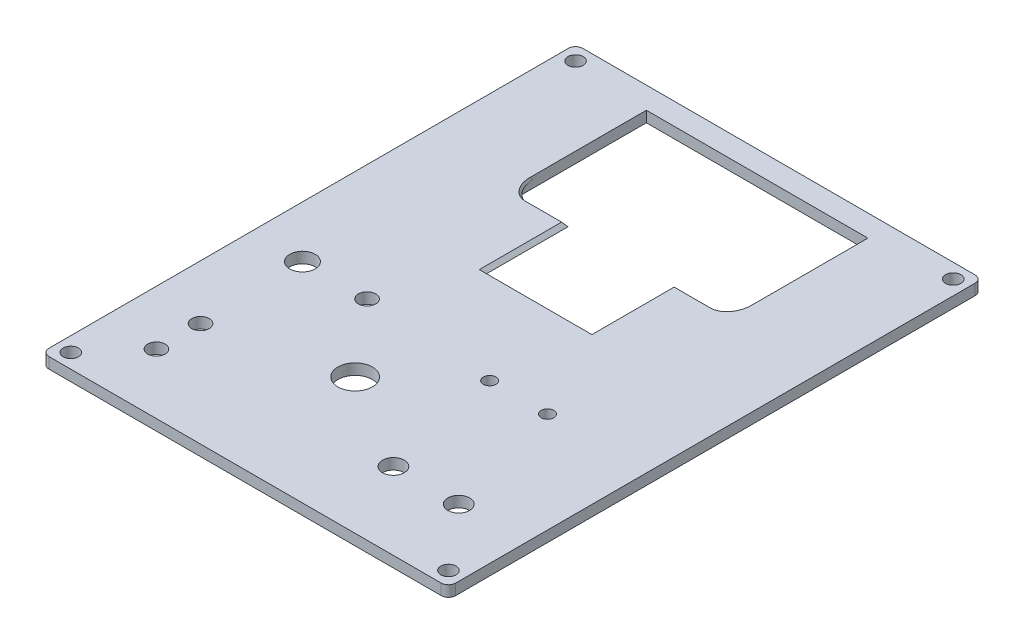
ISO-10303-21;
HEADER;
FILE_DESCRIPTION(('STEP AP214'),'2;1');
FILE_NAME('part.step','',(''),(''),'','','');
FILE_SCHEMA(('AUTOMOTIVE_DESIGN { 1 0 10303 214 1 1 1 1 }'));
ENDSEC;
DATA;
#1=APPLICATION_CONTEXT('core data for automotive mechanical design processes');
#2=APPLICATION_PROTOCOL_DEFINITION('international standard','automotive_design',2000,#1);
#3=PRODUCT_CONTEXT('',#1,'mechanical');
#4=PRODUCT('Part','Part','',(#3));
#5=PRODUCT_RELATED_PRODUCT_CATEGORY('part','',(#4));
#6=PRODUCT_DEFINITION_FORMATION('','',#4);
#7=PRODUCT_DEFINITION_CONTEXT('part definition',#1,'design');
#8=PRODUCT_DEFINITION('design','',#6,#7);
#9=PRODUCT_DEFINITION_SHAPE('','',#8);
#10=(LENGTH_UNIT() NAMED_UNIT(*) SI_UNIT(.MILLI.,.METRE.));
#11=(NAMED_UNIT(*) PLANE_ANGLE_UNIT() SI_UNIT($,.RADIAN.));
#12=(NAMED_UNIT(*) SI_UNIT($,.STERADIAN.) SOLID_ANGLE_UNIT());
#13=UNCERTAINTY_MEASURE_WITH_UNIT(LENGTH_MEASURE(1.E-05),#10,'distance_accuracy_value','');
#14=(GEOMETRIC_REPRESENTATION_CONTEXT(3) GLOBAL_UNCERTAINTY_ASSIGNED_CONTEXT((#13)) GLOBAL_UNIT_ASSIGNED_CONTEXT((#10,
#11,#12)) REPRESENTATION_CONTEXT('',''));
#15=CARTESIAN_POINT('',(0.,0.,0.));
#16=DIRECTION('',(0.,0.,1.));
#17=DIRECTION('',(1.,0.,0.));
#18=AXIS2_PLACEMENT_3D('',#15,#16,#17);
#19=CARTESIAN_POINT('',(-30.5,0.,-6.50000000000001));
#20=DIRECTION('',(0.,0.,1.));
#21=DIRECTION('',(1.,0.,0.));
#22=AXIS2_PLACEMENT_3D('',#19,#20,#21);
#23=PLANE('',#22);
#24=DIRECTION('',(1.,0.,0.));
#25=VECTOR('',#24,1.);
#26=CARTESIAN_POINT('',(-30.5,3.,-6.50000000000001));
#27=LINE('',#26,#25);
#28=CARTESIAN_POINT('',(-15.5000000000001,3.,-6.50000000000001));
#29=VERTEX_POINT('',#28);
#30=CARTESIAN_POINT('',(15.5000000000001,3.,-6.50000000000001));
#31=VERTEX_POINT('',#30);
#32=EDGE_CURVE('E215',#29,#31,#27,.T.);
#33=ORIENTED_EDGE('',*,*,#32,.T.);
#34=DIRECTION('',(0.707106781186551,0.707106781186544,0.));
#35=VECTOR('',#34,1.);
#36=CARTESIAN_POINT('',(-9.00000000000019,-21.5,-6.50000000000001));
#37=LINE('',#36,#35);
#38=CARTESIAN_POINT('',(14.5000000000001,2.,-6.50000000000001));
#39=VERTEX_POINT('',#38);
#40=EDGE_CURVE('E183',#31,#39,#37,.F.);
#41=ORIENTED_EDGE('',*,*,#40,.T.);
#42=DIRECTION('',(1.,0.,0.));
#43=VECTOR('',#42,1.);
#44=CARTESIAN_POINT('',(-30.5,2.,-6.50000000000001));
#45=LINE('',#44,#43);
#46=CARTESIAN_POINT('',(30.5,2.,-6.50000000000001));
#47=VERTEX_POINT('',#46);
#48=EDGE_CURVE('E175',#39,#47,#45,.T.);
#49=ORIENTED_EDGE('',*,*,#48,.T.);
#50=DIRECTION('',(0.,1.,0.));
#51=VECTOR('',#50,1.);
#52=CARTESIAN_POINT('',(30.5,0.,-6.50000000000001));
#53=LINE('',#52,#51);
#54=CARTESIAN_POINT('',(30.5,0.,-6.50000000000001));
#55=VERTEX_POINT('',#54);
#56=EDGE_CURVE('E180',#55,#47,#53,.T.);
#57=ORIENTED_EDGE('',*,*,#56,.F.);
#58=DIRECTION('',(1.,0.,0.));
#59=VECTOR('',#58,1.);
#60=CARTESIAN_POINT('',(-30.5,0.,-6.50000000000001));
#61=LINE('',#60,#59);
#62=CARTESIAN_POINT('',(-30.5,0.,-6.50000000000001));
#63=VERTEX_POINT('',#62);
#64=EDGE_CURVE('E222',#63,#55,#61,.T.);
#65=ORIENTED_EDGE('',*,*,#64,.F.);
#66=DIRECTION('',(0.,1.,0.));
#67=VECTOR('',#66,1.);
#68=CARTESIAN_POINT('',(-30.5,0.,-6.50000000000001));
#69=LINE('',#68,#67);
#70=CARTESIAN_POINT('',(-30.5,2.,-6.50000000000001));
#71=VERTEX_POINT('',#70);
#72=EDGE_CURVE('E206',#63,#71,#69,.T.);
#73=ORIENTED_EDGE('',*,*,#72,.T.);
#74=DIRECTION('',(1.,0.,0.));
#75=VECTOR('',#74,1.);
#76=CARTESIAN_POINT('',(-30.5,2.,-6.50000000000001));
#77=LINE('',#76,#75);
#78=CARTESIAN_POINT('',(-14.5000000000001,2.,-6.50000000000001));
#79=VERTEX_POINT('',#78);
#80=EDGE_CURVE('E187',#71,#79,#77,.T.);
#81=ORIENTED_EDGE('',*,*,#80,.T.);
#82=DIRECTION('',(-0.707106781186551,0.707106781186544,0.));
#83=VECTOR('',#82,1.);
#84=CARTESIAN_POINT('',(-21.5000000000001,8.99999999999997,-6.50000000000001));
#85=LINE('',#84,#83);
#86=EDGE_CURVE('E332',#79,#29,#85,.T.);
#87=ORIENTED_EDGE('',*,*,#86,.T.);
#88=EDGE_LOOP('',(#33,#41,#49,#57,#65,#73,#81,#87));
#89=FACE_BOUND('',#88,.T.);
#90=ADVANCED_FACE('F40',(#89),#23,.F.);
#91=CARTESIAN_POINT('',(-30.5,0.,-67.5));
#92=DIRECTION('',(-1.,0.,0.));
#93=DIRECTION('',(0.,0.,1.));
#94=AXIS2_PLACEMENT_3D('',#91,#92,#93);
#95=PLANE('',#94);
#96=DIRECTION('',(0.,0.,1.));
#97=VECTOR('',#96,1.);
#98=CARTESIAN_POINT('',(-30.5,3.,-67.5));
#99=LINE('',#98,#97);
#100=CARTESIAN_POINT('',(-30.5,3.,-67.5));
#101=VERTEX_POINT('',#100);
#102=CARTESIAN_POINT('',(-30.5,3.,-35.5012341958427));
#103=VERTEX_POINT('',#102);
#104=EDGE_CURVE('E385',#101,#103,#99,.T.);
#105=ORIENTED_EDGE('',*,*,#104,.T.);
#106=DIRECTION('',(0.,-0.788010753606718,-0.615661475325663));
#107=VECTOR('',#106,1.);
#108=CARTESIAN_POINT('',(-30.5,-14.3870156963397,-49.0854596472398));
#109=LINE('',#108,#107);
#110=CARTESIAN_POINT('',(-30.5,2.,-36.2825198223495));
#111=VERTEX_POINT('',#110);
#112=EDGE_CURVE('E354',#103,#111,#109,.T.);
#113=ORIENTED_EDGE('',*,*,#112,.T.);
#114=DIRECTION('',(0.,0.,1.));
#115=VECTOR('',#114,1.);
#116=CARTESIAN_POINT('',(-30.5,2.,-67.5));
#117=LINE('',#116,#115);
#118=EDGE_CURVE('E325',#111,#71,#117,.T.);
#119=ORIENTED_EDGE('',*,*,#118,.T.);
#120=ORIENTED_EDGE('',*,*,#72,.F.);
#121=DIRECTION('',(0.,0.,1.));
#122=VECTOR('',#121,1.);
#123=CARTESIAN_POINT('',(-30.5,0.,-67.5));
#124=LINE('',#123,#122);
#125=CARTESIAN_POINT('',(-30.5,0.,-67.5));
#126=VERTEX_POINT('',#125);
#127=EDGE_CURVE('E389',#126,#63,#124,.T.);
#128=ORIENTED_EDGE('',*,*,#127,.F.);
#129=DIRECTION('',(0.,1.,0.));
#130=VECTOR('',#129,1.);
#131=CARTESIAN_POINT('',(-30.5,0.,-67.5));
#132=LINE('',#131,#130);
#133=EDGE_CURVE('E212',#126,#101,#132,.T.);
#134=ORIENTED_EDGE('',*,*,#133,.T.);
#135=EDGE_LOOP('',(#105,#113,#119,#120,#128,#134));
#136=FACE_BOUND('',#135,.T.);
#137=ADVANCED_FACE('F440',(#136),#95,.F.);
#138=CARTESIAN_POINT('',(56.,3.,-73.5));
#139=DIRECTION('',(-1.,0.,0.));
#140=DIRECTION('',(0.,0.,1.));
#141=AXIS2_PLACEMENT_3D('',#138,#139,#140);
#142=PLANE('',#141);
#143=DIRECTION('',(0.,0.,-1.));
#144=VECTOR('',#143,1.);
#145=CARTESIAN_POINT('',(56.,0.,-73.5));
#146=LINE('',#145,#144);
#147=CARTESIAN_POINT('',(56.,0.,71.5));
#148=VERTEX_POINT('',#147);
#149=CARTESIAN_POINT('',(56.,0.,-71.5));
#150=VERTEX_POINT('',#149);
#151=EDGE_CURVE('E205',#148,#150,#146,.T.);
#152=ORIENTED_EDGE('',*,*,#151,.T.);
#153=DIRECTION('',(0.,-1.,0.));
#154=VECTOR('',#153,1.);
#155=CARTESIAN_POINT('',(56.,3.,-71.5));
#156=LINE('',#155,#154);
#157=CARTESIAN_POINT('',(56.,3.,-71.5));
#158=VERTEX_POINT('',#157);
#159=EDGE_CURVE('E318',#150,#158,#156,.F.);
#160=ORIENTED_EDGE('',*,*,#159,.T.);
#161=DIRECTION('',(0.,0.,-1.));
#162=VECTOR('',#161,1.);
#163=CARTESIAN_POINT('',(56.,3.,-73.5));
#164=LINE('',#163,#162);
#165=CARTESIAN_POINT('',(56.,3.,71.5));
#166=VERTEX_POINT('',#165);
#167=EDGE_CURVE('E223',#166,#158,#164,.T.);
#168=ORIENTED_EDGE('',*,*,#167,.F.);
#169=DIRECTION('',(0.,-1.,0.));
#170=VECTOR('',#169,1.);
#171=CARTESIAN_POINT('',(56.,3.,71.5));
#172=LINE('',#171,#170);
#173=EDGE_CURVE('E315',#166,#148,#172,.T.);
#174=ORIENTED_EDGE('',*,*,#173,.T.);
#175=EDGE_LOOP('',(#152,#160,#168,#174));
#176=FACE_BOUND('',#175,.T.);
#177=ADVANCED_FACE('F471',(#176),#142,.F.);
#178=CARTESIAN_POINT('',(-56.,3.,-73.5));
#179=DIRECTION('',(0.,0.,1.));
#180=DIRECTION('',(1.,0.,0.));
#181=AXIS2_PLACEMENT_3D('',#178,#179,#180);
#182=PLANE('',#181);
#183=DIRECTION('',(-1.,0.,0.));
#184=VECTOR('',#183,1.);
#185=CARTESIAN_POINT('',(-56.,0.,-73.5));
#186=LINE('',#185,#184);
#187=CARTESIAN_POINT('',(54.,0.,-73.5));
#188=VERTEX_POINT('',#187);
#189=CARTESIAN_POINT('',(-54.,0.,-73.5));
#190=VERTEX_POINT('',#189);
#191=EDGE_CURVE('E209',#188,#190,#186,.T.);
#192=ORIENTED_EDGE('',*,*,#191,.T.);
#193=DIRECTION('',(0.,-1.,0.));
#194=VECTOR('',#193,1.);
#195=CARTESIAN_POINT('',(-54.,3.,-73.5));
#196=LINE('',#195,#194);
#197=CARTESIAN_POINT('',(-54.,3.,-73.5));
#198=VERTEX_POINT('',#197);
#199=EDGE_CURVE('E305',#190,#198,#196,.F.);
#200=ORIENTED_EDGE('',*,*,#199,.T.);
#201=DIRECTION('',(-1.,0.,0.));
#202=VECTOR('',#201,1.);
#203=CARTESIAN_POINT('',(-56.,3.,-73.5));
#204=LINE('',#203,#202);
#205=CARTESIAN_POINT('',(54.,3.,-73.5));
#206=VERTEX_POINT('',#205);
#207=EDGE_CURVE('E226',#206,#198,#204,.T.);
#208=ORIENTED_EDGE('',*,*,#207,.F.);
#209=DIRECTION('',(0.,-1.,0.));
#210=VECTOR('',#209,1.);
#211=CARTESIAN_POINT('',(54.,3.,-73.5));
#212=LINE('',#211,#210);
#213=EDGE_CURVE('E302',#206,#188,#212,.T.);
#214=ORIENTED_EDGE('',*,*,#213,.T.);
#215=EDGE_LOOP('',(#192,#200,#208,#214));
#216=FACE_BOUND('',#215,.T.);
#217=ADVANCED_FACE('F480',(#216),#182,.F.);
#218=CARTESIAN_POINT('',(-56.,3.,-73.5));
#219=DIRECTION('',(1.,0.,0.));
#220=DIRECTION('',(0.,0.,-1.));
#221=AXIS2_PLACEMENT_3D('',#218,#219,#220);
#222=PLANE('',#221);
#223=DIRECTION('',(0.,0.,1.));
#224=VECTOR('',#223,1.);
#225=CARTESIAN_POINT('',(-56.,3.,-73.5));
#226=LINE('',#225,#224);
#227=CARTESIAN_POINT('',(-56.,3.,-71.5));
#228=VERTEX_POINT('',#227);
#229=CARTESIAN_POINT('',(-56.,3.,71.5));
#230=VERTEX_POINT('',#229);
#231=EDGE_CURVE('E230',#228,#230,#226,.T.);
#232=ORIENTED_EDGE('',*,*,#231,.F.);
#233=DIRECTION('',(0.,-1.,0.));
#234=VECTOR('',#233,1.);
#235=CARTESIAN_POINT('',(-56.,3.,-71.5));
#236=LINE('',#235,#234);
#237=CARTESIAN_POINT('',(-56.,0.,-71.5));
#238=VERTEX_POINT('',#237);
#239=EDGE_CURVE('E291',#228,#238,#236,.T.);
#240=ORIENTED_EDGE('',*,*,#239,.T.);
#241=DIRECTION('',(0.,0.,1.));
#242=VECTOR('',#241,1.);
#243=CARTESIAN_POINT('',(-56.,0.,-73.5));
#244=LINE('',#243,#242);
#245=CARTESIAN_POINT('',(-56.,0.,71.5));
#246=VERTEX_POINT('',#245);
#247=EDGE_CURVE('E239',#238,#246,#244,.T.);
#248=ORIENTED_EDGE('',*,*,#247,.T.);
#249=DIRECTION('',(0.,-1.,0.));
#250=VECTOR('',#249,1.);
#251=CARTESIAN_POINT('',(-56.,3.,71.5));
#252=LINE('',#251,#250);
#253=EDGE_CURVE('E235',#246,#230,#252,.F.);
#254=ORIENTED_EDGE('',*,*,#253,.T.);
#255=EDGE_LOOP('',(#232,#240,#248,#254));
#256=FACE_BOUND('',#255,.T.);
#257=ADVANCED_FACE('F453',(#256),#222,.F.);
#258=CARTESIAN_POINT('',(-56.,3.,73.5));
#259=DIRECTION('',(0.,0.,-1.));
#260=DIRECTION('',(-1.,0.,0.));
#261=AXIS2_PLACEMENT_3D('',#258,#259,#260);
#262=PLANE('',#261);
#263=DIRECTION('',(1.,0.,0.));
#264=VECTOR('',#263,1.);
#265=CARTESIAN_POINT('',(-56.,0.,73.5));
#266=LINE('',#265,#264);
#267=CARTESIAN_POINT('',(-54.,0.,73.5));
#268=VERTEX_POINT('',#267);
#269=CARTESIAN_POINT('',(54.,0.,73.5));
#270=VERTEX_POINT('',#269);
#271=EDGE_CURVE('E227',#268,#270,#266,.T.);
#272=ORIENTED_EDGE('',*,*,#271,.T.);
#273=DIRECTION('',(0.,-1.,0.));
#274=VECTOR('',#273,1.);
#275=CARTESIAN_POINT('',(54.,3.,73.5));
#276=LINE('',#275,#274);
#277=CARTESIAN_POINT('',(54.,3.,73.5));
#278=VERTEX_POINT('',#277);
#279=EDGE_CURVE('E323',#270,#278,#276,.F.);
#280=ORIENTED_EDGE('',*,*,#279,.T.);
#281=DIRECTION('',(1.,0.,0.));
#282=VECTOR('',#281,1.);
#283=CARTESIAN_POINT('',(-56.,3.,73.5));
#284=LINE('',#283,#282);
#285=CARTESIAN_POINT('',(-54.,3.,73.5));
#286=VERTEX_POINT('',#285);
#287=EDGE_CURVE('E233',#286,#278,#284,.T.);
#288=ORIENTED_EDGE('',*,*,#287,.F.);
#289=DIRECTION('',(0.,-1.,0.));
#290=VECTOR('',#289,1.);
#291=CARTESIAN_POINT('',(-54.,3.,73.5));
#292=LINE('',#291,#290);
#293=EDGE_CURVE('E320',#286,#268,#292,.T.);
#294=ORIENTED_EDGE('',*,*,#293,.T.);
#295=EDGE_LOOP('',(#272,#280,#288,#294));
#296=FACE_BOUND('',#295,.T.);
#297=ADVANCED_FACE('F463',(#296),#262,.F.);
#298=CARTESIAN_POINT('',(0.,3.,0.));
#299=DIRECTION('',(0.,1.,0.));
#300=DIRECTION('',(0.,0.,1.));
#301=AXIS2_PLACEMENT_3D('',#298,#299,#300);
#302=PLANE('',#301);
#303=DIRECTION('',(0.,0.,-1.));
#304=VECTOR('',#303,1.);
#305=CARTESIAN_POINT('',(30.5,3.,-67.5));
#306=LINE('',#305,#304);
#307=CARTESIAN_POINT('',(30.5,3.,-35.5012341958427));
#308=VERTEX_POINT('',#307);
#309=CARTESIAN_POINT('',(30.5,3.,-67.5));
#310=VERTEX_POINT('',#309);
#311=EDGE_CURVE('E272',#308,#310,#306,.T.);
#312=ORIENTED_EDGE('',*,*,#311,.F.);
#313=CARTESIAN_POINT('',(25.5,3.,-35.5012341958427));
#314=DIRECTION('',(0.,1.,0.));
#315=DIRECTION('',(0.,0.,-1.));
#316=AXIS2_PLACEMENT_3D('',#313,#314,#315);
#317=ELLIPSE('',#316,6.34509107536292,5.);
#318=CARTESIAN_POINT('',(25.5,3.,-29.1561431204798));
#319=VERTEX_POINT('',#318);
#320=EDGE_CURVE('E358',#308,#319,#317,.F.);
#321=ORIENTED_EDGE('',*,*,#320,.T.);
#322=DIRECTION('',(-1.,0.,0.));
#323=VECTOR('',#322,1.);
#324=CARTESIAN_POINT('',(0.,3.,-29.1561431204798));
#325=LINE('',#324,#323);
#326=CARTESIAN_POINT('',(15.5000000000001,3.,-29.1561431204798));
#327=VERTEX_POINT('',#326);
#328=EDGE_CURVE('E344',#319,#327,#325,.T.);
#329=ORIENTED_EDGE('',*,*,#328,.T.);
#330=DIRECTION('',(0.,0.,1.));
#331=VECTOR('',#330,1.);
#332=CARTESIAN_POINT('',(15.5000000000001,3.,0.));
#333=LINE('',#332,#331);
#334=EDGE_CURVE('E341',#327,#31,#333,.T.);
#335=ORIENTED_EDGE('',*,*,#334,.T.);
#336=ORIENTED_EDGE('',*,*,#32,.F.);
#337=DIRECTION('',(0.,0.,-1.));
#338=VECTOR('',#337,1.);
#339=CARTESIAN_POINT('',(-15.5000000000001,3.,-31.5));
#340=LINE('',#339,#338);
#341=CARTESIAN_POINT('',(-15.5000000000001,3.,-29.1561431204798));
#342=VERTEX_POINT('',#341);
#343=EDGE_CURVE('E327',#29,#342,#340,.T.);
#344=ORIENTED_EDGE('',*,*,#343,.T.);
#345=DIRECTION('',(-1.,0.,0.));
#346=VECTOR('',#345,1.);
#347=CARTESIAN_POINT('',(-30.5,3.,-29.1561431204798));
#348=LINE('',#347,#346);
#349=CARTESIAN_POINT('',(-25.5,3.,-29.1561431204798));
#350=VERTEX_POINT('',#349);
#351=EDGE_CURVE('E335',#342,#350,#348,.T.);
#352=ORIENTED_EDGE('',*,*,#351,.T.);
#353=CARTESIAN_POINT('',(-25.5,3.,-35.5012341958427));
#354=DIRECTION('',(0.,1.,0.));
#355=DIRECTION('',(0.,0.,-1.));
#356=AXIS2_PLACEMENT_3D('',#353,#354,#355);
#357=ELLIPSE('',#356,6.34509107536292,5.);
#358=EDGE_CURVE('E11',#350,#103,#357,.F.);
#359=ORIENTED_EDGE('',*,*,#358,.T.);
#360=ORIENTED_EDGE('',*,*,#104,.F.);
#361=DIRECTION('',(-1.,0.,0.));
#362=VECTOR('',#361,1.);
#363=CARTESIAN_POINT('',(-30.5,3.,-67.5));
#364=LINE('',#363,#362);
#365=EDGE_CURVE('E375',#310,#101,#364,.T.);
#366=ORIENTED_EDGE('',*,*,#365,.F.);
#367=EDGE_LOOP('',(#312,#321,#329,#335,#336,#344,#352,#359,#360,#366));
#368=FACE_BOUND('',#367,.T.);
#369=CARTESIAN_POINT('',(-52.,3.,-69.5));
#370=DIRECTION('',(0.,-1.,0.));
#371=DIRECTION('',(0.,0.,-1.));
#372=AXIS2_PLACEMENT_3D('',#369,#370,#371);
#373=CIRCLE('',#372,2.1);
#374=CARTESIAN_POINT('',(-52.,3.,-71.6));
#375=VERTEX_POINT('',#374);
#376=EDGE_CURVE('E289',#375,#375,#373,.T.);
#377=ORIENTED_EDGE('',*,*,#376,.T.);
#378=EDGE_LOOP('',(#377));
#379=FACE_BOUND('',#378,.T.);
#380=CARTESIAN_POINT('',(52.,3.,-69.5));
#381=DIRECTION('',(0.,1.,0.));
#382=DIRECTION('',(0.,0.,-1.));
#383=AXIS2_PLACEMENT_3D('',#380,#381,#382);
#384=CIRCLE('',#383,2.1);
#385=CARTESIAN_POINT('',(52.,3.,-71.6));
#386=VERTEX_POINT('',#385);
#387=EDGE_CURVE('E285',#386,#386,#384,.T.);
#388=ORIENTED_EDGE('',*,*,#387,.F.);
#389=EDGE_LOOP('',(#388));
#390=FACE_BOUND('',#389,.T.);
#391=CARTESIAN_POINT('',(52.,3.,69.5));
#392=DIRECTION('',(0.,-1.,0.));
#393=DIRECTION('',(0.,0.,1.));
#394=AXIS2_PLACEMENT_3D('',#391,#392,#393);
#395=CIRCLE('',#394,2.1);
#396=CARTESIAN_POINT('',(52.,3.,71.6));
#397=VERTEX_POINT('',#396);
#398=EDGE_CURVE('E281',#397,#397,#395,.T.);
#399=ORIENTED_EDGE('',*,*,#398,.T.);
#400=EDGE_LOOP('',(#399));
#401=FACE_BOUND('',#400,.T.);
#402=CARTESIAN_POINT('',(-52.,3.,69.5));
#403=DIRECTION('',(0.,1.,0.));
#404=DIRECTION('',(0.,0.,1.));
#405=AXIS2_PLACEMENT_3D('',#402,#403,#404);
#406=CIRCLE('',#405,2.1);
#407=CARTESIAN_POINT('',(-52.,3.,71.6));
#408=VERTEX_POINT('',#407);
#409=EDGE_CURVE('E277',#408,#408,#406,.T.);
#410=ORIENTED_EDGE('',*,*,#409,.F.);
#411=EDGE_LOOP('',(#410));
#412=FACE_BOUND('',#411,.T.);
#413=CARTESIAN_POINT('',(-41.0102408172861,3.,44.7633050489493));
#414=DIRECTION('',(0.,1.,0.));
#415=DIRECTION('',(0.,0.,1.));
#416=AXIS2_PLACEMENT_3D('',#413,#414,#415);
#417=CIRCLE('',#416,2.4);
#418=CARTESIAN_POINT('',(-41.0102408172861,3.,47.1633050489493));
#419=VERTEX_POINT('',#418);
#420=EDGE_CURVE('E403',#419,#419,#417,.T.);
#421=ORIENTED_EDGE('',*,*,#420,.F.);
#422=EDGE_LOOP('',(#421));
#423=FACE_BOUND('',#422,.T.);
#424=CARTESIAN_POINT('',(28.345,3.,18.57));
#425=DIRECTION('',(0.,1.,0.));
#426=DIRECTION('',(0.,0.,1.));
#427=AXIS2_PLACEMENT_3D('',#424,#425,#426);
#428=CIRCLE('',#427,1.75);
#429=CARTESIAN_POINT('',(28.345,3.,20.32));
#430=VERTEX_POINT('',#429);
#431=EDGE_CURVE('E400',#430,#430,#428,.T.);
#432=ORIENTED_EDGE('',*,*,#431,.F.);
#433=EDGE_LOOP('',(#432));
#434=FACE_BOUND('',#433,.T.);
#435=CARTESIAN_POINT('',(12.415,3.,18.57));
#436=DIRECTION('',(0.,1.,0.));
#437=DIRECTION('',(0.,0.,1.));
#438=AXIS2_PLACEMENT_3D('',#435,#436,#437);
#439=CIRCLE('',#438,1.75);
#440=CARTESIAN_POINT('',(12.415,3.,20.32));
#441=VERTEX_POINT('',#440);
#442=EDGE_CURVE('E397',#441,#441,#439,.T.);
#443=ORIENTED_EDGE('',*,*,#442,.F.);
#444=EDGE_LOOP('',(#443));
#445=FACE_BOUND('',#444,.T.);
#446=CARTESIAN_POINT('',(-23.9665294193606,3.,15.9470773610624));
#447=DIRECTION('',(0.,1.,0.));
#448=DIRECTION('',(0.,0.,1.));
#449=AXIS2_PLACEMENT_3D('',#446,#447,#448);
#450=CIRCLE('',#449,2.4);
#451=CARTESIAN_POINT('',(-23.9665294193606,3.,18.3470773610624));
#452=VERTEX_POINT('',#451);
#453=EDGE_CURVE('E396',#452,#452,#450,.T.);
#454=ORIENTED_EDGE('',*,*,#453,.F.);
#455=EDGE_LOOP('',(#454));
#456=FACE_BOUND('',#455,.T.);
#457=CARTESIAN_POINT('',(-41.0102408172861,3.,56.9073477755815));
#458=DIRECTION('',(0.,1.,0.));
#459=DIRECTION('',(0.,0.,1.));
#460=AXIS2_PLACEMENT_3D('',#457,#458,#459);
#461=CIRCLE('',#460,2.4);
#462=CARTESIAN_POINT('',(-41.0102408172861,3.,59.3073477755815));
#463=VERTEX_POINT('',#462);
#464=EDGE_CURVE('E406',#463,#463,#461,.T.);
#465=ORIENTED_EDGE('',*,*,#464,.F.);
#466=EDGE_LOOP('',(#465));
#467=FACE_BOUND('',#466,.T.);
#468=CARTESIAN_POINT('',(-41.7534962426308,3.,15.9470773610624));
#469=DIRECTION('',(0.,1.,0.));
#470=DIRECTION('',(0.,0.,1.));
#471=AXIS2_PLACEMENT_3D('',#468,#469,#470);
#472=CIRCLE('',#471,3.5);
#473=CARTESIAN_POINT('',(-41.7534962426308,3.,19.4470773610624));
#474=VERTEX_POINT('',#473);
#475=EDGE_CURVE('E414',#474,#474,#472,.T.);
#476=ORIENTED_EDGE('',*,*,#475,.F.);
#477=EDGE_LOOP('',(#476));
#478=FACE_BOUND('',#477,.T.);
#479=CARTESIAN_POINT('',(19.6127537581251,3.,52.2790008630662));
#480=DIRECTION('',(0.,1.,0.));
#481=DIRECTION('',(0.,0.,1.));
#482=AXIS2_PLACEMENT_3D('',#479,#480,#481);
#483=CIRCLE('',#482,3.);
#484=CARTESIAN_POINT('',(19.6127537581251,3.,55.2790008630662));
#485=VERTEX_POINT('',#484);
#486=EDGE_CURVE('E411',#485,#485,#483,.T.);
#487=ORIENTED_EDGE('',*,*,#486,.F.);
#488=EDGE_LOOP('',(#487));
#489=FACE_BOUND('',#488,.T.);
#490=CARTESIAN_POINT('',(37.6127537581251,3.,52.2790008630662));
#491=DIRECTION('',(0.,1.,0.));
#492=DIRECTION('',(0.,0.,1.));
#493=AXIS2_PLACEMENT_3D('',#490,#491,#492);
#494=CIRCLE('',#493,3.);
#495=CARTESIAN_POINT('',(37.6127537581251,3.,55.2790008630662));
#496=VERTEX_POINT('',#495);
#497=EDGE_CURVE('E276',#496,#496,#494,.T.);
#498=ORIENTED_EDGE('',*,*,#497,.F.);
#499=EDGE_LOOP('',(#498));
#500=FACE_BOUND('',#499,.T.);
#501=CARTESIAN_POINT('',(-7.,3.,36.1963783257266));
#502=DIRECTION('',(0.,1.,0.));
#503=DIRECTION('',(0.,0.,1.));
#504=AXIS2_PLACEMENT_3D('',#501,#502,#503);
#505=CIRCLE('',#504,4.75);
#506=CARTESIAN_POINT('',(-7.,3.,40.9463783257266));
#507=VERTEX_POINT('',#506);
#508=EDGE_CURVE('E248',#507,#507,#505,.T.);
#509=ORIENTED_EDGE('',*,*,#508,.F.);
#510=EDGE_LOOP('',(#509));
#511=FACE_BOUND('',#510,.T.);
#512=ORIENTED_EDGE('',*,*,#207,.T.);
#513=CARTESIAN_POINT('',(-54.,3.,-71.5));
#514=DIRECTION('',(0.,1.,0.));
#515=DIRECTION('',(0.,0.,1.));
#516=AXIS2_PLACEMENT_3D('',#513,#514,#515);
#517=CIRCLE('',#516,2.);
#518=EDGE_CURVE('E313',#198,#228,#517,.T.);
#519=ORIENTED_EDGE('',*,*,#518,.T.);
#520=ORIENTED_EDGE('',*,*,#231,.T.);
#521=CARTESIAN_POINT('',(-54.,3.,71.5));
#522=DIRECTION('',(0.,1.,0.));
#523=DIRECTION('',(0.,0.,1.));
#524=AXIS2_PLACEMENT_3D('',#521,#522,#523);
#525=CIRCLE('',#524,2.);
#526=EDGE_CURVE('E307',#230,#286,#525,.T.);
#527=ORIENTED_EDGE('',*,*,#526,.T.);
#528=ORIENTED_EDGE('',*,*,#287,.T.);
#529=CARTESIAN_POINT('',(54.,3.,71.5));
#530=DIRECTION('',(0.,1.,0.));
#531=DIRECTION('',(0.,0.,1.));
#532=AXIS2_PLACEMENT_3D('',#529,#530,#531);
#533=CIRCLE('',#532,2.);
#534=EDGE_CURVE('E309',#278,#166,#533,.T.);
#535=ORIENTED_EDGE('',*,*,#534,.T.);
#536=ORIENTED_EDGE('',*,*,#167,.T.);
#537=CARTESIAN_POINT('',(54.,3.,-71.5));
#538=DIRECTION('',(0.,1.,0.));
#539=DIRECTION('',(0.,0.,1.));
#540=AXIS2_PLACEMENT_3D('',#537,#538,#539);
#541=CIRCLE('',#540,2.);
#542=EDGE_CURVE('E311',#158,#206,#541,.T.);
#543=ORIENTED_EDGE('',*,*,#542,.T.);
#544=EDGE_LOOP('',(#512,#519,#520,#527,#528,#535,#536,#543));
#545=FACE_BOUND('',#544,.T.);
#546=ADVANCED_FACE('F363',(#368,#379,#390,#401,#412,#423,#434,#445,#456,#467,#478,#489,#500,
#511,#545),#302,.T.);
#547=CARTESIAN_POINT('',(0.,0.,0.));
#548=DIRECTION('',(0.,1.,0.));
#549=DIRECTION('',(0.,0.,1.));
#550=AXIS2_PLACEMENT_3D('',#547,#548,#549);
#551=PLANE('',#550);
#552=CARTESIAN_POINT('',(-52.,0.,-69.5));
#553=DIRECTION('',(0.,1.,0.));
#554=DIRECTION('',(0.,0.,1.));
#555=AXIS2_PLACEMENT_3D('',#552,#553,#554);
#556=CIRCLE('',#555,2.1);
#557=CARTESIAN_POINT('',(-52.,0.,-67.4));
#558=VERTEX_POINT('',#557);
#559=EDGE_CURVE('E286',#558,#558,#556,.F.);
#560=ORIENTED_EDGE('',*,*,#559,.F.);
#561=EDGE_LOOP('',(#560));
#562=FACE_BOUND('',#561,.T.);
#563=CARTESIAN_POINT('',(52.,0.,-69.5));
#564=DIRECTION('',(0.,1.,0.));
#565=DIRECTION('',(0.,0.,1.));
#566=AXIS2_PLACEMENT_3D('',#563,#564,#565);
#567=CIRCLE('',#566,2.1);
#568=CARTESIAN_POINT('',(52.,0.,-67.4));
#569=VERTEX_POINT('',#568);
#570=EDGE_CURVE('E282',#569,#569,#567,.T.);
#571=ORIENTED_EDGE('',*,*,#570,.T.);
#572=EDGE_LOOP('',(#571));
#573=FACE_BOUND('',#572,.T.);
#574=CARTESIAN_POINT('',(52.,0.,69.5));
#575=DIRECTION('',(0.,1.,0.));
#576=DIRECTION('',(0.,0.,1.));
#577=AXIS2_PLACEMENT_3D('',#574,#575,#576);
#578=CIRCLE('',#577,2.1);
#579=CARTESIAN_POINT('',(52.,0.,71.6));
#580=VERTEX_POINT('',#579);
#581=EDGE_CURVE('E278',#580,#580,#578,.F.);
#582=ORIENTED_EDGE('',*,*,#581,.F.);
#583=EDGE_LOOP('',(#582));
#584=FACE_BOUND('',#583,.T.);
#585=CARTESIAN_POINT('',(-52.,0.,69.5));
#586=DIRECTION('',(0.,1.,0.));
#587=DIRECTION('',(0.,0.,1.));
#588=AXIS2_PLACEMENT_3D('',#585,#586,#587);
#589=CIRCLE('',#588,2.1);
#590=CARTESIAN_POINT('',(-52.,0.,71.6));
#591=VERTEX_POINT('',#590);
#592=EDGE_CURVE('E273',#591,#591,#589,.T.);
#593=ORIENTED_EDGE('',*,*,#592,.T.);
#594=EDGE_LOOP('',(#593));
#595=FACE_BOUND('',#594,.T.);
#596=CARTESIAN_POINT('',(-41.0102408172861,0.,44.7633050489493));
#597=DIRECTION('',(0.,1.,0.));
#598=DIRECTION('',(0.,0.,1.));
#599=AXIS2_PLACEMENT_3D('',#596,#597,#598);
#600=CIRCLE('',#599,2.4);
#601=CARTESIAN_POINT('',(-41.0102408172861,0.,47.1633050489493));
#602=VERTEX_POINT('',#601);
#603=EDGE_CURVE('E269',#602,#602,#600,.T.);
#604=ORIENTED_EDGE('',*,*,#603,.T.);
#605=EDGE_LOOP('',(#604));
#606=FACE_BOUND('',#605,.T.);
#607=CARTESIAN_POINT('',(28.345,0.,18.57));
#608=DIRECTION('',(0.,1.,0.));
#609=DIRECTION('',(0.,0.,1.));
#610=AXIS2_PLACEMENT_3D('',#607,#608,#609);
#611=CIRCLE('',#610,1.75);
#612=CARTESIAN_POINT('',(28.345,0.,20.32));
#613=VERTEX_POINT('',#612);
#614=EDGE_CURVE('E266',#613,#613,#611,.T.);
#615=ORIENTED_EDGE('',*,*,#614,.T.);
#616=EDGE_LOOP('',(#615));
#617=FACE_BOUND('',#616,.T.);
#618=CARTESIAN_POINT('',(12.415,0.,18.57));
#619=DIRECTION('',(0.,1.,0.));
#620=DIRECTION('',(0.,0.,1.));
#621=AXIS2_PLACEMENT_3D('',#618,#619,#620);
#622=CIRCLE('',#621,1.75);
#623=CARTESIAN_POINT('',(12.415,0.,20.32));
#624=VERTEX_POINT('',#623);
#625=EDGE_CURVE('E263',#624,#624,#622,.T.);
#626=ORIENTED_EDGE('',*,*,#625,.T.);
#627=EDGE_LOOP('',(#626));
#628=FACE_BOUND('',#627,.T.);
#629=CARTESIAN_POINT('',(-23.9665294193606,0.,15.9470773610624));
#630=DIRECTION('',(0.,1.,0.));
#631=DIRECTION('',(0.,0.,1.));
#632=AXIS2_PLACEMENT_3D('',#629,#630,#631);
#633=CIRCLE('',#632,2.4);
#634=CARTESIAN_POINT('',(-23.9665294193606,0.,18.3470773610624));
#635=VERTEX_POINT('',#634);
#636=EDGE_CURVE('E260',#635,#635,#633,.T.);
#637=ORIENTED_EDGE('',*,*,#636,.T.);
#638=EDGE_LOOP('',(#637));
#639=FACE_BOUND('',#638,.T.);
#640=CARTESIAN_POINT('',(-41.0102408172861,0.,56.9073477755815));
#641=DIRECTION('',(0.,1.,0.));
#642=DIRECTION('',(0.,0.,1.));
#643=AXIS2_PLACEMENT_3D('',#640,#641,#642);
#644=CIRCLE('',#643,2.4);
#645=CARTESIAN_POINT('',(-41.0102408172861,0.,59.3073477755815));
#646=VERTEX_POINT('',#645);
#647=EDGE_CURVE('E257',#646,#646,#644,.T.);
#648=ORIENTED_EDGE('',*,*,#647,.T.);
#649=EDGE_LOOP('',(#648));
#650=FACE_BOUND('',#649,.T.);
#651=CARTESIAN_POINT('',(-41.7534962426308,0.,15.9470773610624));
#652=DIRECTION('',(0.,1.,0.));
#653=DIRECTION('',(0.,0.,1.));
#654=AXIS2_PLACEMENT_3D('',#651,#652,#653);
#655=CIRCLE('',#654,3.5);
#656=CARTESIAN_POINT('',(-41.7534962426308,0.,19.4470773610624));
#657=VERTEX_POINT('',#656);
#658=EDGE_CURVE('E254',#657,#657,#655,.T.);
#659=ORIENTED_EDGE('',*,*,#658,.T.);
#660=EDGE_LOOP('',(#659));
#661=FACE_BOUND('',#660,.T.);
#662=CARTESIAN_POINT('',(19.6127537581251,0.,52.2790008630662));
#663=DIRECTION('',(0.,1.,0.));
#664=DIRECTION('',(0.,0.,1.));
#665=AXIS2_PLACEMENT_3D('',#662,#663,#664);
#666=CIRCLE('',#665,3.);
#667=CARTESIAN_POINT('',(19.6127537581251,0.,55.2790008630662));
#668=VERTEX_POINT('',#667);
#669=EDGE_CURVE('E251',#668,#668,#666,.T.);
#670=ORIENTED_EDGE('',*,*,#669,.T.);
#671=EDGE_LOOP('',(#670));
#672=FACE_BOUND('',#671,.T.);
#673=CARTESIAN_POINT('',(37.6127537581251,0.,52.2790008630662));
#674=DIRECTION('',(0.,1.,0.));
#675=DIRECTION('',(0.,0.,1.));
#676=AXIS2_PLACEMENT_3D('',#673,#674,#675);
#677=CIRCLE('',#676,3.);
#678=CARTESIAN_POINT('',(37.6127537581251,0.,55.2790008630662));
#679=VERTEX_POINT('',#678);
#680=EDGE_CURVE('E247',#679,#679,#677,.T.);
#681=ORIENTED_EDGE('',*,*,#680,.T.);
#682=EDGE_LOOP('',(#681));
#683=FACE_BOUND('',#682,.T.);
#684=CARTESIAN_POINT('',(-7.,0.,36.1963783257266));
#685=DIRECTION('',(0.,1.,0.));
#686=DIRECTION('',(0.,0.,1.));
#687=AXIS2_PLACEMENT_3D('',#684,#685,#686);
#688=CIRCLE('',#687,4.75);
#689=CARTESIAN_POINT('',(-7.,0.,40.9463783257266));
#690=VERTEX_POINT('',#689);
#691=EDGE_CURVE('E244',#690,#690,#688,.T.);
#692=ORIENTED_EDGE('',*,*,#691,.T.);
#693=EDGE_LOOP('',(#692));
#694=FACE_BOUND('',#693,.T.);
#695=ORIENTED_EDGE('',*,*,#64,.T.);
#696=DIRECTION('',(0.,0.,-1.));
#697=VECTOR('',#696,1.);
#698=CARTESIAN_POINT('',(30.5,0.,-67.5));
#699=LINE('',#698,#697);
#700=CARTESIAN_POINT('',(30.5,0.,-67.5));
#701=VERTEX_POINT('',#700);
#702=EDGE_CURVE('E203',#55,#701,#699,.T.);
#703=ORIENTED_EDGE('',*,*,#702,.T.);
#704=DIRECTION('',(-1.,0.,0.));
#705=VECTOR('',#704,1.);
#706=CARTESIAN_POINT('',(-30.5,0.,-67.5));
#707=LINE('',#706,#705);
#708=EDGE_CURVE('E383',#701,#126,#707,.T.);
#709=ORIENTED_EDGE('',*,*,#708,.T.);
#710=ORIENTED_EDGE('',*,*,#127,.T.);
#711=EDGE_LOOP('',(#695,#703,#709,#710));
#712=FACE_BOUND('',#711,.T.);
#713=ORIENTED_EDGE('',*,*,#247,.F.);
#714=CARTESIAN_POINT('',(-54.,0.,-71.5));
#715=DIRECTION('',(0.,1.,0.));
#716=DIRECTION('',(0.,0.,1.));
#717=AXIS2_PLACEMENT_3D('',#714,#715,#716);
#718=CIRCLE('',#717,2.);
#719=EDGE_CURVE('E300',#238,#190,#718,.F.);
#720=ORIENTED_EDGE('',*,*,#719,.T.);
#721=ORIENTED_EDGE('',*,*,#191,.F.);
#722=CARTESIAN_POINT('',(54.,0.,-71.5));
#723=DIRECTION('',(0.,1.,0.));
#724=DIRECTION('',(0.,0.,1.));
#725=AXIS2_PLACEMENT_3D('',#722,#723,#724);
#726=CIRCLE('',#725,2.);
#727=EDGE_CURVE('E298',#188,#150,#726,.F.);
#728=ORIENTED_EDGE('',*,*,#727,.T.);
#729=ORIENTED_EDGE('',*,*,#151,.F.);
#730=CARTESIAN_POINT('',(54.,0.,71.5));
#731=DIRECTION('',(0.,1.,0.));
#732=DIRECTION('',(0.,0.,1.));
#733=AXIS2_PLACEMENT_3D('',#730,#731,#732);
#734=CIRCLE('',#733,2.);
#735=EDGE_CURVE('E296',#148,#270,#734,.F.);
#736=ORIENTED_EDGE('',*,*,#735,.T.);
#737=ORIENTED_EDGE('',*,*,#271,.F.);
#738=CARTESIAN_POINT('',(-54.,0.,71.5));
#739=DIRECTION('',(0.,1.,0.));
#740=DIRECTION('',(0.,0.,1.));
#741=AXIS2_PLACEMENT_3D('',#738,#739,#740);
#742=CIRCLE('',#741,2.);
#743=EDGE_CURVE('E294',#268,#246,#742,.F.);
#744=ORIENTED_EDGE('',*,*,#743,.T.);
#745=EDGE_LOOP('',(#713,#720,#721,#728,#729,#736,#737,#744));
#746=FACE_BOUND('',#745,.T.);
#747=ADVANCED_FACE('F442',(#562,#573,#584,#595,#606,#617,#628,#639,#650,#661,#672,#683,#694,
#712,#746),#551,.F.);
#748=CARTESIAN_POINT('',(30.5,0.,-67.5));
#749=DIRECTION('',(1.,0.,0.));
#750=DIRECTION('',(0.,0.,-1.));
#751=AXIS2_PLACEMENT_3D('',#748,#749,#750);
#752=PLANE('',#751);
#753=DIRECTION('',(0.,0.,-1.));
#754=VECTOR('',#753,1.);
#755=CARTESIAN_POINT('',(30.5,2.,-67.5));
#756=LINE('',#755,#754);
#757=CARTESIAN_POINT('',(30.5,2.,-36.2825198223495));
#758=VERTEX_POINT('',#757);
#759=EDGE_CURVE('E190',#47,#758,#756,.T.);
#760=ORIENTED_EDGE('',*,*,#759,.T.);
#761=DIRECTION('',(0.,-0.788010753606718,-0.615661475325663));
#762=VECTOR('',#761,1.);
#763=CARTESIAN_POINT('',(30.5,-14.3870156963397,-49.0854596472398));
#764=LINE('',#763,#762);
#765=EDGE_CURVE('E350',#758,#308,#764,.F.);
#766=ORIENTED_EDGE('',*,*,#765,.T.);
#767=ORIENTED_EDGE('',*,*,#311,.T.);
#768=DIRECTION('',(0.,1.,0.));
#769=VECTOR('',#768,1.);
#770=CARTESIAN_POINT('',(30.5,0.,-67.5));
#771=LINE('',#770,#769);
#772=EDGE_CURVE('E219',#701,#310,#771,.T.);
#773=ORIENTED_EDGE('',*,*,#772,.F.);
#774=ORIENTED_EDGE('',*,*,#702,.F.);
#775=ORIENTED_EDGE('',*,*,#56,.T.);
#776=EDGE_LOOP('',(#760,#766,#767,#773,#774,#775));
#777=FACE_BOUND('',#776,.T.);
#778=ADVANCED_FACE('F201',(#777),#752,.F.);
#779=CARTESIAN_POINT('',(-30.5,0.,-67.5));
#780=DIRECTION('',(0.,0.,-1.));
#781=DIRECTION('',(-1.,0.,0.));
#782=AXIS2_PLACEMENT_3D('',#779,#780,#781);
#783=PLANE('',#782);
#784=ORIENTED_EDGE('',*,*,#365,.T.);
#785=ORIENTED_EDGE('',*,*,#133,.F.);
#786=ORIENTED_EDGE('',*,*,#708,.F.);
#787=ORIENTED_EDGE('',*,*,#772,.T.);
#788=EDGE_LOOP('',(#784,#785,#786,#787));
#789=FACE_BOUND('',#788,.T.);
#790=ADVANCED_FACE('F379',(#789),#783,.F.);
#791=CARTESIAN_POINT('',(-7.,-7.,36.1963783257266));
#792=DIRECTION('',(0.,1.,0.));
#793=DIRECTION('',(0.,0.,1.));
#794=AXIS2_PLACEMENT_3D('',#791,#792,#793);
#795=CYLINDRICAL_SURFACE('',#794,4.75);
#796=ORIENTED_EDGE('',*,*,#508,.T.);
#797=EDGE_LOOP('',(#796));
#798=FACE_BOUND('',#797,.T.);
#799=ORIENTED_EDGE('',*,*,#691,.F.);
#800=EDGE_LOOP('',(#799));
#801=FACE_BOUND('',#800,.T.);
#802=ADVANCED_FACE('F503',(#798,#801),#795,.F.);
#803=CARTESIAN_POINT('',(37.6127537581251,-7.,52.2790008630662));
#804=DIRECTION('',(0.,1.,0.));
#805=DIRECTION('',(0.,0.,1.));
#806=AXIS2_PLACEMENT_3D('',#803,#804,#805);
#807=CYLINDRICAL_SURFACE('',#806,3.);
#808=ORIENTED_EDGE('',*,*,#497,.T.);
#809=EDGE_LOOP('',(#808));
#810=FACE_BOUND('',#809,.T.);
#811=ORIENTED_EDGE('',*,*,#680,.F.);
#812=EDGE_LOOP('',(#811));
#813=FACE_BOUND('',#812,.T.);
#814=ADVANCED_FACE('F558',(#810,#813),#807,.F.);
#815=CARTESIAN_POINT('',(19.6127537581251,-7.,52.2790008630662));
#816=DIRECTION('',(0.,1.,0.));
#817=DIRECTION('',(0.,0.,1.));
#818=AXIS2_PLACEMENT_3D('',#815,#816,#817);
#819=CYLINDRICAL_SURFACE('',#818,3.);
#820=ORIENTED_EDGE('',*,*,#486,.T.);
#821=EDGE_LOOP('',(#820));
#822=FACE_BOUND('',#821,.T.);
#823=ORIENTED_EDGE('',*,*,#669,.F.);
#824=EDGE_LOOP('',(#823));
#825=FACE_BOUND('',#824,.T.);
#826=ADVANCED_FACE('F565',(#822,#825),#819,.F.);
#827=CARTESIAN_POINT('',(-41.7534962426308,-7.,15.9470773610624));
#828=DIRECTION('',(0.,1.,0.));
#829=DIRECTION('',(0.,0.,1.));
#830=AXIS2_PLACEMENT_3D('',#827,#828,#829);
#831=CYLINDRICAL_SURFACE('',#830,3.5);
#832=ORIENTED_EDGE('',*,*,#475,.T.);
#833=EDGE_LOOP('',(#832));
#834=FACE_BOUND('',#833,.T.);
#835=ORIENTED_EDGE('',*,*,#658,.F.);
#836=EDGE_LOOP('',(#835));
#837=FACE_BOUND('',#836,.T.);
#838=ADVANCED_FACE('F573',(#834,#837),#831,.F.);
#839=CARTESIAN_POINT('',(-41.0102408172861,-7.,56.9073477755815));
#840=DIRECTION('',(0.,1.,0.));
#841=DIRECTION('',(0.,0.,1.));
#842=AXIS2_PLACEMENT_3D('',#839,#840,#841);
#843=CYLINDRICAL_SURFACE('',#842,2.4);
#844=ORIENTED_EDGE('',*,*,#464,.T.);
#845=EDGE_LOOP('',(#844));
#846=FACE_BOUND('',#845,.T.);
#847=ORIENTED_EDGE('',*,*,#647,.F.);
#848=EDGE_LOOP('',(#847));
#849=FACE_BOUND('',#848,.T.);
#850=ADVANCED_FACE('F581',(#846,#849),#843,.F.);
#851=CARTESIAN_POINT('',(-23.9665294193606,-7.,15.9470773610624));
#852=DIRECTION('',(0.,1.,0.));
#853=DIRECTION('',(0.,0.,1.));
#854=AXIS2_PLACEMENT_3D('',#851,#852,#853);
#855=CYLINDRICAL_SURFACE('',#854,2.4);
#856=ORIENTED_EDGE('',*,*,#453,.T.);
#857=EDGE_LOOP('',(#856));
#858=FACE_BOUND('',#857,.T.);
#859=ORIENTED_EDGE('',*,*,#636,.F.);
#860=EDGE_LOOP('',(#859));
#861=FACE_BOUND('',#860,.T.);
#862=ADVANCED_FACE('F589',(#858,#861),#855,.F.);
#863=CARTESIAN_POINT('',(12.415,-7.,18.57));
#864=DIRECTION('',(0.,1.,0.));
#865=DIRECTION('',(0.,0.,1.));
#866=AXIS2_PLACEMENT_3D('',#863,#864,#865);
#867=CYLINDRICAL_SURFACE('',#866,1.75);
#868=ORIENTED_EDGE('',*,*,#442,.T.);
#869=EDGE_LOOP('',(#868));
#870=FACE_BOUND('',#869,.T.);
#871=ORIENTED_EDGE('',*,*,#625,.F.);
#872=EDGE_LOOP('',(#871));
#873=FACE_BOUND('',#872,.T.);
#874=ADVANCED_FACE('F597',(#870,#873),#867,.F.);
#875=CARTESIAN_POINT('',(28.345,-7.,18.57));
#876=DIRECTION('',(0.,1.,0.));
#877=DIRECTION('',(0.,0.,1.));
#878=AXIS2_PLACEMENT_3D('',#875,#876,#877);
#879=CYLINDRICAL_SURFACE('',#878,1.75);
#880=ORIENTED_EDGE('',*,*,#431,.T.);
#881=EDGE_LOOP('',(#880));
#882=FACE_BOUND('',#881,.T.);
#883=ORIENTED_EDGE('',*,*,#614,.F.);
#884=EDGE_LOOP('',(#883));
#885=FACE_BOUND('',#884,.T.);
#886=ADVANCED_FACE('F605',(#882,#885),#879,.F.);
#887=CARTESIAN_POINT('',(-41.0102408172861,-7.,44.7633050489493));
#888=DIRECTION('',(0.,1.,0.));
#889=DIRECTION('',(0.,0.,1.));
#890=AXIS2_PLACEMENT_3D('',#887,#888,#889);
#891=CYLINDRICAL_SURFACE('',#890,2.4);
#892=ORIENTED_EDGE('',*,*,#420,.T.);
#893=EDGE_LOOP('',(#892));
#894=FACE_BOUND('',#893,.T.);
#895=ORIENTED_EDGE('',*,*,#603,.F.);
#896=EDGE_LOOP('',(#895));
#897=FACE_BOUND('',#896,.T.);
#898=ADVANCED_FACE('F612',(#894,#897),#891,.F.);
#899=CARTESIAN_POINT('',(-52.,-2.,69.5));
#900=DIRECTION('',(0.,1.,0.));
#901=DIRECTION('',(0.,0.,1.));
#902=AXIS2_PLACEMENT_3D('',#899,#900,#901);
#903=CYLINDRICAL_SURFACE('',#902,2.1);
#904=ORIENTED_EDGE('',*,*,#409,.T.);
#905=EDGE_LOOP('',(#904));
#906=FACE_BOUND('',#905,.T.);
#907=ORIENTED_EDGE('',*,*,#592,.F.);
#908=EDGE_LOOP('',(#907));
#909=FACE_BOUND('',#908,.T.);
#910=ADVANCED_FACE('F620',(#906,#909),#903,.F.);
#911=CARTESIAN_POINT('',(52.,-2.,69.5));
#912=DIRECTION('',(0.,1.,0.));
#913=DIRECTION('',(0.,0.,1.));
#914=AXIS2_PLACEMENT_3D('',#911,#912,#913);
#915=CYLINDRICAL_SURFACE('',#914,2.1);
#916=ORIENTED_EDGE('',*,*,#398,.F.);
#917=EDGE_LOOP('',(#916));
#918=FACE_BOUND('',#917,.T.);
#919=ORIENTED_EDGE('',*,*,#581,.T.);
#920=EDGE_LOOP('',(#919));
#921=FACE_BOUND('',#920,.T.);
#922=ADVANCED_FACE('F628',(#918,#921),#915,.F.);
#923=CARTESIAN_POINT('',(52.,-2.,-69.5));
#924=DIRECTION('',(0.,1.,0.));
#925=DIRECTION('',(0.,0.,1.));
#926=AXIS2_PLACEMENT_3D('',#923,#924,#925);
#927=CYLINDRICAL_SURFACE('',#926,2.1);
#928=ORIENTED_EDGE('',*,*,#387,.T.);
#929=EDGE_LOOP('',(#928));
#930=FACE_BOUND('',#929,.T.);
#931=ORIENTED_EDGE('',*,*,#570,.F.);
#932=EDGE_LOOP('',(#931));
#933=FACE_BOUND('',#932,.T.);
#934=ADVANCED_FACE('F492',(#930,#933),#927,.F.);
#935=CARTESIAN_POINT('',(-52.,-2.,-69.5));
#936=DIRECTION('',(0.,1.,0.));
#937=DIRECTION('',(0.,0.,1.));
#938=AXIS2_PLACEMENT_3D('',#935,#936,#937);
#939=CYLINDRICAL_SURFACE('',#938,2.1);
#940=ORIENTED_EDGE('',*,*,#376,.F.);
#941=EDGE_LOOP('',(#940));
#942=FACE_BOUND('',#941,.T.);
#943=ORIENTED_EDGE('',*,*,#559,.T.);
#944=EDGE_LOOP('',(#943));
#945=FACE_BOUND('',#944,.T.);
#946=ADVANCED_FACE('F485',(#942,#945),#939,.F.);
#947=CARTESIAN_POINT('',(-54.,3.,-71.5));
#948=DIRECTION('',(0.,-1.,0.));
#949=DIRECTION('',(0.,0.,-1.));
#950=AXIS2_PLACEMENT_3D('',#947,#948,#949);
#951=CYLINDRICAL_SURFACE('',#950,2.);
#952=ORIENTED_EDGE('',*,*,#518,.F.);
#953=ORIENTED_EDGE('',*,*,#199,.F.);
#954=ORIENTED_EDGE('',*,*,#719,.F.);
#955=ORIENTED_EDGE('',*,*,#239,.F.);
#956=EDGE_LOOP('',(#952,#953,#954,#955));
#957=FACE_BOUND('',#956,.T.);
#958=ADVANCED_FACE('F483',(#957),#951,.T.);
#959=CARTESIAN_POINT('',(54.,3.,-71.5));
#960=DIRECTION('',(0.,-1.,0.));
#961=DIRECTION('',(0.,0.,-1.));
#962=AXIS2_PLACEMENT_3D('',#959,#960,#961);
#963=CYLINDRICAL_SURFACE('',#962,2.);
#964=ORIENTED_EDGE('',*,*,#542,.F.);
#965=ORIENTED_EDGE('',*,*,#159,.F.);
#966=ORIENTED_EDGE('',*,*,#727,.F.);
#967=ORIENTED_EDGE('',*,*,#213,.F.);
#968=EDGE_LOOP('',(#964,#965,#966,#967));
#969=FACE_BOUND('',#968,.T.);
#970=ADVANCED_FACE('F475',(#969),#963,.T.);
#971=CARTESIAN_POINT('',(54.,3.,71.5));
#972=DIRECTION('',(0.,-1.,0.));
#973=DIRECTION('',(0.,0.,-1.));
#974=AXIS2_PLACEMENT_3D('',#971,#972,#973);
#975=CYLINDRICAL_SURFACE('',#974,2.);
#976=ORIENTED_EDGE('',*,*,#534,.F.);
#977=ORIENTED_EDGE('',*,*,#279,.F.);
#978=ORIENTED_EDGE('',*,*,#735,.F.);
#979=ORIENTED_EDGE('',*,*,#173,.F.);
#980=EDGE_LOOP('',(#976,#977,#978,#979));
#981=FACE_BOUND('',#980,.T.);
#982=ADVANCED_FACE('F466',(#981),#975,.T.);
#983=CARTESIAN_POINT('',(-54.,3.,71.5));
#984=DIRECTION('',(0.,-1.,0.));
#985=DIRECTION('',(0.,0.,-1.));
#986=AXIS2_PLACEMENT_3D('',#983,#984,#985);
#987=CYLINDRICAL_SURFACE('',#986,2.);
#988=ORIENTED_EDGE('',*,*,#526,.F.);
#989=ORIENTED_EDGE('',*,*,#253,.F.);
#990=ORIENTED_EDGE('',*,*,#743,.F.);
#991=ORIENTED_EDGE('',*,*,#293,.F.);
#992=EDGE_LOOP('',(#988,#989,#990,#991));
#993=FACE_BOUND('',#992,.T.);
#994=ADVANCED_FACE('F457',(#993),#987,.T.);
#995=CARTESIAN_POINT('',(0.,2.,0.));
#996=DIRECTION('',(0.,-1.,0.));
#997=DIRECTION('',(0.,0.,-1.));
#998=AXIS2_PLACEMENT_3D('',#995,#996,#997);
#999=PLANE('',#998);
#1000=ORIENTED_EDGE('',*,*,#118,.F.);
#1001=CARTESIAN_POINT('',(-25.5,2.,-36.2825198223495));
#1002=DIRECTION('',(0.,-1.,0.));
#1003=DIRECTION('',(0.,0.,-1.));
#1004=AXIS2_PLACEMENT_3D('',#1001,#1002,#1003);
#1005=ELLIPSE('',#1004,6.34509107536292,5.);
#1006=CARTESIAN_POINT('',(-25.5,2.,-29.9374287469865));
#1007=VERTEX_POINT('',#1006);
#1008=EDGE_CURVE('E48',#111,#1007,#1005,.F.);
#1009=ORIENTED_EDGE('',*,*,#1008,.T.);
#1010=DIRECTION('',(1.,0.,0.));
#1011=VECTOR('',#1010,1.);
#1012=CARTESIAN_POINT('',(0.,2.,-29.9374287469865));
#1013=LINE('',#1012,#1011);
#1014=CARTESIAN_POINT('',(-14.5000000000001,2.,-29.9374287469865));
#1015=VERTEX_POINT('',#1014);
#1016=EDGE_CURVE('E337',#1007,#1015,#1013,.T.);
#1017=ORIENTED_EDGE('',*,*,#1016,.T.);
#1018=DIRECTION('',(0.,0.,1.));
#1019=VECTOR('',#1018,1.);
#1020=CARTESIAN_POINT('',(-14.5000000000001,2.,0.));
#1021=LINE('',#1020,#1019);
#1022=EDGE_CURVE('E330',#1015,#79,#1021,.T.);
#1023=ORIENTED_EDGE('',*,*,#1022,.T.);
#1024=ORIENTED_EDGE('',*,*,#80,.F.);
#1025=EDGE_LOOP('',(#1000,#1009,#1017,#1023,#1024));
#1026=FACE_BOUND('',#1025,.T.);
#1027=ADVANCED_FACE('F675',(#1026),#999,.T.);
#1028=CARTESIAN_POINT('',(-15.5000000000001,3.,0.));
#1029=DIRECTION('',(0.707106781186544,0.707106781186551,0.));
#1030=DIRECTION('',(0.,0.,1.));
#1031=AXIS2_PLACEMENT_3D('',#1028,#1029,#1030);
#1032=PLANE('',#1031);
#1033=ORIENTED_EDGE('',*,*,#1022,.F.);
#1034=DIRECTION('',(-0.618936177129701,0.618936177129695,0.483565938916452));
#1035=VECTOR('',#1034,1.);
#1036=CARTESIAN_POINT('',(-24.2263302372868,11.7263302372866,-22.3383867339368));
#1037=LINE('',#1036,#1035);
#1038=EDGE_CURVE('E199',#1015,#342,#1037,.T.);
#1039=ORIENTED_EDGE('',*,*,#1038,.T.);
#1040=ORIENTED_EDGE('',*,*,#343,.F.);
#1041=ORIENTED_EDGE('',*,*,#86,.F.);
#1042=EDGE_LOOP('',(#1033,#1039,#1040,#1041));
#1043=FACE_BOUND('',#1042,.T.);
#1044=ADVANCED_FACE('F433',(#1043),#1032,.T.);
#1045=CARTESIAN_POINT('',(0.,3.,-29.1561431204798));
#1046=DIRECTION('',(0.,0.615661475325663,-0.788010753606718));
#1047=DIRECTION('',(1.,0.,0.));
#1048=AXIS2_PLACEMENT_3D('',#1045,#1046,#1047);
#1049=PLANE('',#1048);
#1050=ORIENTED_EDGE('',*,*,#1016,.F.);
#1051=DIRECTION('',(0.,-0.788010753606718,-0.615661475325663));
#1052=VECTOR('',#1051,1.);
#1053=CARTESIAN_POINT('',(-25.5,3.,-29.1561431204798));
#1054=LINE('',#1053,#1052);
#1055=EDGE_CURVE('E55',#1007,#350,#1054,.F.);
#1056=ORIENTED_EDGE('',*,*,#1055,.T.);
#1057=ORIENTED_EDGE('',*,*,#351,.F.);
#1058=ORIENTED_EDGE('',*,*,#1038,.F.);
#1059=EDGE_LOOP('',(#1050,#1056,#1057,#1058));
#1060=FACE_BOUND('',#1059,.T.);
#1061=ADVANCED_FACE('F436',(#1060),#1049,.T.);
#1062=CARTESIAN_POINT('',(0.,2.,0.));
#1063=DIRECTION('',(0.,-1.,0.));
#1064=DIRECTION('',(0.,0.,-1.));
#1065=AXIS2_PLACEMENT_3D('',#1062,#1063,#1064);
#1066=PLANE('',#1065);
#1067=DIRECTION('',(0.,0.,1.));
#1068=VECTOR('',#1067,1.);
#1069=CARTESIAN_POINT('',(14.5000000000001,2.,0.));
#1070=LINE('',#1069,#1068);
#1071=CARTESIAN_POINT('',(14.5000000000001,2.,-29.9374287469865));
#1072=VERTEX_POINT('',#1071);
#1073=EDGE_CURVE('E198',#39,#1072,#1070,.F.);
#1074=ORIENTED_EDGE('',*,*,#1073,.T.);
#1075=DIRECTION('',(-1.,0.,0.));
#1076=VECTOR('',#1075,1.);
#1077=CARTESIAN_POINT('',(0.,2.,-29.9374287469865));
#1078=LINE('',#1077,#1076);
#1079=CARTESIAN_POINT('',(25.5,2.,-29.9374287469865));
#1080=VERTEX_POINT('',#1079);
#1081=EDGE_CURVE('E346',#1072,#1080,#1078,.F.);
#1082=ORIENTED_EDGE('',*,*,#1081,.T.);
#1083=CARTESIAN_POINT('',(25.5,2.,-36.2825198223495));
#1084=DIRECTION('',(0.,-1.,0.));
#1085=DIRECTION('',(0.,0.,-1.));
#1086=AXIS2_PLACEMENT_3D('',#1083,#1084,#1085);
#1087=ELLIPSE('',#1086,6.34509107536292,5.);
#1088=EDGE_CURVE('E194',#1080,#758,#1087,.F.);
#1089=ORIENTED_EDGE('',*,*,#1088,.T.);
#1090=ORIENTED_EDGE('',*,*,#759,.F.);
#1091=ORIENTED_EDGE('',*,*,#48,.F.);
#1092=EDGE_LOOP('',(#1074,#1082,#1089,#1090,#1091));
#1093=FACE_BOUND('',#1092,.T.);
#1094=ADVANCED_FACE('F191',(#1093),#1066,.T.);
#1095=CARTESIAN_POINT('',(10.5,-2.00000000000004,-31.5));
#1096=DIRECTION('',(0.707106781186544,-0.707106781186551,0.));
#1097=DIRECTION('',(0.,0.,-1.));
#1098=AXIS2_PLACEMENT_3D('',#1095,#1096,#1097);
#1099=PLANE('',#1098);
#1100=ORIENTED_EDGE('',*,*,#334,.F.);
#1101=DIRECTION('',(-0.618936177129701,-0.618936177129695,-0.483565938916452));
#1102=VECTOR('',#1101,1.);
#1103=CARTESIAN_POINT('',(10.9676720345603,-1.53232796543973,-32.6971858144923));
#1104=LINE('',#1103,#1102);
#1105=EDGE_CURVE('E348',#327,#1072,#1104,.T.);
#1106=ORIENTED_EDGE('',*,*,#1105,.T.);
#1107=ORIENTED_EDGE('',*,*,#1073,.F.);
#1108=ORIENTED_EDGE('',*,*,#40,.F.);
#1109=EDGE_LOOP('',(#1100,#1106,#1107,#1108));
#1110=FACE_BOUND('',#1109,.T.);
#1111=ADVANCED_FACE('F720',(#1110),#1099,.F.);
#1112=CARTESIAN_POINT('',(47.520085876684,0.,-31.5));
#1113=DIRECTION('',(0.,-0.615661475325663,0.788010753606718));
#1114=DIRECTION('',(1.,0.,0.));
#1115=AXIS2_PLACEMENT_3D('',#1112,#1113,#1114);
#1116=PLANE('',#1115);
#1117=ORIENTED_EDGE('',*,*,#328,.F.);
#1118=DIRECTION('',(0.,0.788010753606718,0.615661475325663));
#1119=VECTOR('',#1118,1.);
#1120=CARTESIAN_POINT('',(25.5,0.,-31.5));
#1121=LINE('',#1120,#1119);
#1122=EDGE_CURVE('E352',#319,#1080,#1121,.F.);
#1123=ORIENTED_EDGE('',*,*,#1122,.T.);
#1124=ORIENTED_EDGE('',*,*,#1081,.F.);
#1125=ORIENTED_EDGE('',*,*,#1105,.F.);
#1126=EDGE_LOOP('',(#1117,#1123,#1124,#1125));
#1127=FACE_BOUND('',#1126,.T.);
#1128=ADVANCED_FACE('F370',(#1127),#1116,.F.);
#1129=CARTESIAN_POINT('',(25.5,-14.3870156963397,-49.0854596472398));
#1130=DIRECTION('',(0.,-0.788010753606718,-0.615661475325663));
#1131=DIRECTION('',(0.,0.615661475325663,-0.788010753606718));
#1132=AXIS2_PLACEMENT_3D('',#1129,#1130,#1131);
#1133=CYLINDRICAL_SURFACE('',#1132,5.);
#1134=ORIENTED_EDGE('',*,*,#1088,.F.);
#1135=ORIENTED_EDGE('',*,*,#1122,.F.);
#1136=ORIENTED_EDGE('',*,*,#320,.F.);
#1137=ORIENTED_EDGE('',*,*,#765,.F.);
#1138=EDGE_LOOP('',(#1134,#1135,#1136,#1137));
#1139=FACE_BOUND('',#1138,.T.);
#1140=ADVANCED_FACE('F373',(#1139),#1133,.F.);
#1141=CARTESIAN_POINT('',(-25.5,-14.3870156963397,-49.0854596472398));
#1142=DIRECTION('',(0.,-0.788010753606718,-0.615661475325663));
#1143=DIRECTION('',(0.,0.615661475325663,-0.788010753606718));
#1144=AXIS2_PLACEMENT_3D('',#1141,#1142,#1143);
#1145=CYLINDRICAL_SURFACE('',#1144,5.);
#1146=ORIENTED_EDGE('',*,*,#358,.F.);
#1147=ORIENTED_EDGE('',*,*,#1055,.F.);
#1148=ORIENTED_EDGE('',*,*,#1008,.F.);
#1149=ORIENTED_EDGE('',*,*,#112,.F.);
#1150=EDGE_LOOP('',(#1146,#1147,#1148,#1149));
#1151=FACE_BOUND('',#1150,.T.);
#1152=ADVANCED_FACE('F42',(#1151),#1145,.F.);
#1153=CLOSED_SHELL('',(#90,#137,#177,#217,#257,#297,#546,#747,#778,#790,#802,#814,#826,#838,
#850,#862,#874,#886,#898,#910,#922,#934,#946,#958,#970,#982,#994,#1027,#1044,#1061,#1094,#1111,
#1128,#1140,#1152));
#1154=MANIFOLD_SOLID_BREP('B2',#1153);
#1155=ADVANCED_BREP_SHAPE_REPRESENTATION('',(#18,#1154),#14);
#1156=SHAPE_DEFINITION_REPRESENTATION(#9,#1155);
ENDSEC;
END-ISO-10303-21;
